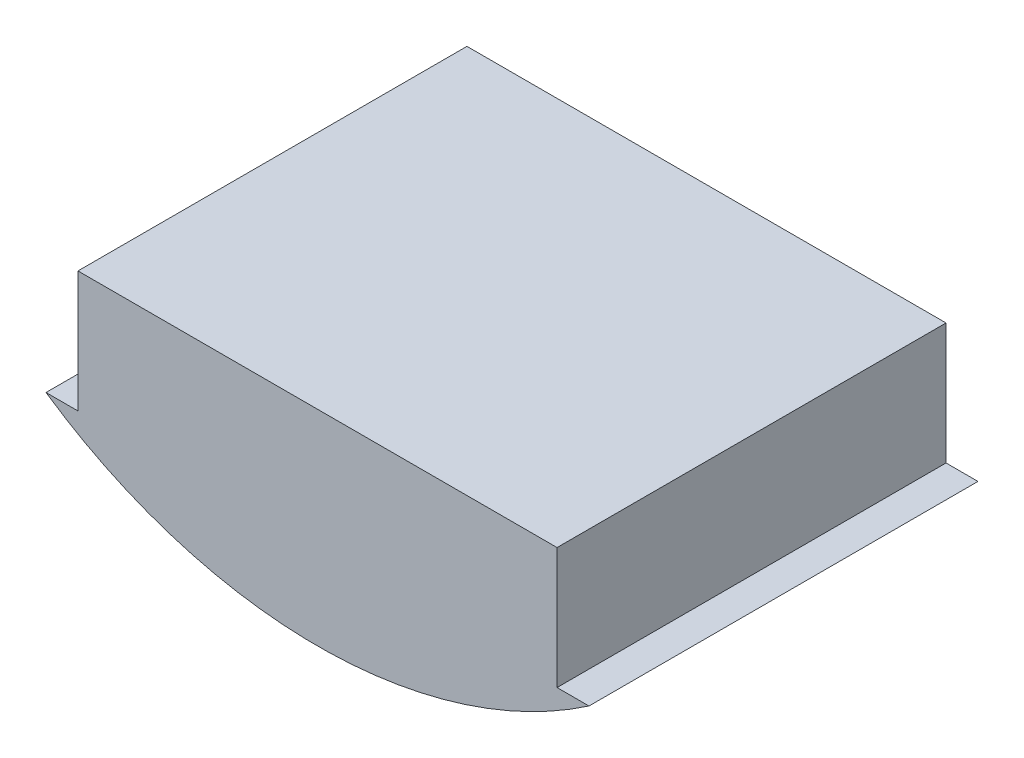
ISO-10303-21;
HEADER;
FILE_DESCRIPTION(('STEP AP214'),'2;1');
FILE_NAME('part.step','',(''),(''),'','','');
FILE_SCHEMA(('AUTOMOTIVE_DESIGN { 1 0 10303 214 1 1 1 1 }'));
ENDSEC;
DATA;
#1=APPLICATION_CONTEXT('core data for automotive mechanical design processes');
#2=APPLICATION_PROTOCOL_DEFINITION('international standard','automotive_design',2000,#1);
#3=PRODUCT_CONTEXT('',#1,'mechanical');
#4=PRODUCT('Part','Part','',(#3));
#5=PRODUCT_RELATED_PRODUCT_CATEGORY('part','',(#4));
#6=PRODUCT_DEFINITION_FORMATION('','',#4);
#7=PRODUCT_DEFINITION_CONTEXT('part definition',#1,'design');
#8=PRODUCT_DEFINITION('design','',#6,#7);
#9=PRODUCT_DEFINITION_SHAPE('','',#8);
#10=(LENGTH_UNIT() NAMED_UNIT(*) SI_UNIT(.MILLI.,.METRE.));
#11=(NAMED_UNIT(*) PLANE_ANGLE_UNIT() SI_UNIT($,.RADIAN.));
#12=(NAMED_UNIT(*) SI_UNIT($,.STERADIAN.) SOLID_ANGLE_UNIT());
#13=UNCERTAINTY_MEASURE_WITH_UNIT(LENGTH_MEASURE(1.E-05),#10,'distance_accuracy_value','');
#14=(GEOMETRIC_REPRESENTATION_CONTEXT(3) GLOBAL_UNCERTAINTY_ASSIGNED_CONTEXT((#13)) GLOBAL_UNIT_ASSIGNED_CONTEXT((#10,
#11,#12)) REPRESENTATION_CONTEXT('',''));
#15=CARTESIAN_POINT('',(0.,0.,0.));
#16=DIRECTION('',(0.,0.,1.));
#17=DIRECTION('',(1.,0.,0.));
#18=AXIS2_PLACEMENT_3D('',#15,#16,#17);
#19=CARTESIAN_POINT('',(0.,-40.910956910097,59.6890545936463));
#20=DIRECTION('',(0.,-1.,0.));
#21=DIRECTION('',(1.,0.,0.));
#22=AXIS2_PLACEMENT_3D('',#19,#20,#21);
#23=PLANE('',#22);
#24=DIRECTION('',(0.,0.,-1.));
#25=VECTOR('',#24,1.);
#26=CARTESIAN_POINT('',(24.6330793796293,-40.9109569100969,59.6890545936463));
#27=LINE('',#26,#25);
#28=CARTESIAN_POINT('',(24.6330793796293,-40.9109569100969,0.));
#29=VERTEX_POINT('',#28);
#30=CARTESIAN_POINT('',(24.6330793796293,-40.9109569100969,-40.));
#31=VERTEX_POINT('',#30);
#32=EDGE_CURVE('E126',#29,#31,#27,.T.);
#33=ORIENTED_EDGE('',*,*,#32,.F.);
#34=DIRECTION('',(1.,0.,0.));
#35=VECTOR('',#34,1.);
#36=CARTESIAN_POINT('',(0.,-40.910956910097,0.));
#37=LINE('',#36,#35);
#38=CARTESIAN_POINT('',(27.9197869744773,-40.9109569100969,0.));
#39=VERTEX_POINT('',#38);
#40=EDGE_CURVE('E50',#29,#39,#37,.T.);
#41=ORIENTED_EDGE('',*,*,#40,.T.);
#42=DIRECTION('',(0.,0.,-1.));
#43=VECTOR('',#42,1.);
#44=CARTESIAN_POINT('',(27.9197869744773,-40.9109569100969,59.6890545936463));
#45=LINE('',#44,#43);
#46=CARTESIAN_POINT('',(27.9197869744773,-40.9109569100969,-40.));
#47=VERTEX_POINT('',#46);
#48=EDGE_CURVE('E93',#39,#47,#45,.T.);
#49=ORIENTED_EDGE('',*,*,#48,.T.);
#50=DIRECTION('',(-1.,0.,0.));
#51=VECTOR('',#50,1.);
#52=CARTESIAN_POINT('',(0.,-40.910956910097,-40.));
#53=LINE('',#52,#51);
#54=EDGE_CURVE('E96',#47,#31,#53,.T.);
#55=ORIENTED_EDGE('',*,*,#54,.T.);
#56=EDGE_LOOP('',(#33,#41,#49,#55));
#57=FACE_BOUND('',#56,.T.);
#58=ADVANCED_FACE('F43',(#57),#23,.F.);
#59=CARTESIAN_POINT('',(24.6330793796293,0.,59.6890545936463));
#60=DIRECTION('',(-1.,0.,0.));
#61=DIRECTION('',(0.,-1.,0.));
#62=AXIS2_PLACEMENT_3D('',#59,#60,#61);
#63=PLANE('',#62);
#64=DIRECTION('',(0.,0.,-1.));
#65=VECTOR('',#64,1.);
#66=CARTESIAN_POINT('',(24.6330793796293,-28.4414908188724,59.6890545936463));
#67=LINE('',#66,#65);
#68=CARTESIAN_POINT('',(24.6330793796293,-28.4414908188724,0.));
#69=VERTEX_POINT('',#68);
#70=CARTESIAN_POINT('',(24.6330793796293,-28.4414908188724,-40.));
#71=VERTEX_POINT('',#70);
#72=EDGE_CURVE('E129',#69,#71,#67,.T.);
#73=ORIENTED_EDGE('',*,*,#72,.F.);
#74=DIRECTION('',(0.,-1.,0.));
#75=VECTOR('',#74,1.);
#76=CARTESIAN_POINT('',(24.6330793796293,0.,0.));
#77=LINE('',#76,#75);
#78=EDGE_CURVE('E57',#69,#29,#77,.T.);
#79=ORIENTED_EDGE('',*,*,#78,.T.);
#80=ORIENTED_EDGE('',*,*,#32,.T.);
#81=DIRECTION('',(0.,1.,0.));
#82=VECTOR('',#81,1.);
#83=CARTESIAN_POINT('',(24.6330793796293,0.,-40.));
#84=LINE('',#83,#82);
#85=EDGE_CURVE('E101',#31,#71,#84,.T.);
#86=ORIENTED_EDGE('',*,*,#85,.T.);
#87=EDGE_LOOP('',(#73,#79,#80,#86));
#88=FACE_BOUND('',#87,.T.);
#89=ADVANCED_FACE('F147',(#88),#63,.F.);
#90=CARTESIAN_POINT('',(0.,-28.4414908188724,59.6890545936463));
#91=DIRECTION('',(0.,-1.,0.));
#92=DIRECTION('',(0.,0.,-1.));
#93=AXIS2_PLACEMENT_3D('',#90,#91,#92);
#94=PLANE('',#93);
#95=DIRECTION('',(0.,0.,-1.));
#96=VECTOR('',#95,1.);
#97=CARTESIAN_POINT('',(-24.6330793796293,-28.4414908188724,59.6890545936463));
#98=LINE('',#97,#96);
#99=CARTESIAN_POINT('',(-24.6330793796293,-28.4414908188724,0.));
#100=VERTEX_POINT('',#99);
#101=CARTESIAN_POINT('',(-24.6330793796293,-28.4414908188724,-40.));
#102=VERTEX_POINT('',#101);
#103=EDGE_CURVE('E131',#100,#102,#98,.T.);
#104=ORIENTED_EDGE('',*,*,#103,.F.);
#105=DIRECTION('',(1.,0.,0.));
#106=VECTOR('',#105,1.);
#107=CARTESIAN_POINT('',(0.,-28.4414908188724,0.));
#108=LINE('',#107,#106);
#109=EDGE_CURVE('E61',#100,#69,#108,.T.);
#110=ORIENTED_EDGE('',*,*,#109,.T.);
#111=ORIENTED_EDGE('',*,*,#72,.T.);
#112=DIRECTION('',(-1.,0.,0.));
#113=VECTOR('',#112,1.);
#114=CARTESIAN_POINT('',(0.,-28.4414908188724,-40.));
#115=LINE('',#114,#113);
#116=EDGE_CURVE('E122',#71,#102,#115,.T.);
#117=ORIENTED_EDGE('',*,*,#116,.T.);
#118=EDGE_LOOP('',(#104,#110,#111,#117));
#119=FACE_BOUND('',#118,.T.);
#120=ADVANCED_FACE('F144',(#119),#94,.F.);
#121=CARTESIAN_POINT('',(-24.6330793796293,0.,59.6890545936463));
#122=DIRECTION('',(1.,0.,0.));
#123=DIRECTION('',(0.,1.,0.));
#124=AXIS2_PLACEMENT_3D('',#121,#122,#123);
#125=PLANE('',#124);
#126=DIRECTION('',(0.,0.,-1.));
#127=VECTOR('',#126,1.);
#128=CARTESIAN_POINT('',(-24.6330793796293,-40.9109569100969,59.6890545936463));
#129=LINE('',#128,#127);
#130=CARTESIAN_POINT('',(-24.6330793796293,-40.9109569100969,0.));
#131=VERTEX_POINT('',#130);
#132=CARTESIAN_POINT('',(-24.6330793796293,-40.9109569100969,-40.));
#133=VERTEX_POINT('',#132);
#134=EDGE_CURVE('E133',#131,#133,#129,.T.);
#135=ORIENTED_EDGE('',*,*,#134,.F.);
#136=DIRECTION('',(0.,1.,0.));
#137=VECTOR('',#136,1.);
#138=CARTESIAN_POINT('',(-24.6330793796293,0.,0.));
#139=LINE('',#138,#137);
#140=EDGE_CURVE('E149',#131,#100,#139,.T.);
#141=ORIENTED_EDGE('',*,*,#140,.T.);
#142=ORIENTED_EDGE('',*,*,#103,.T.);
#143=DIRECTION('',(0.,-1.,0.));
#144=VECTOR('',#143,1.);
#145=CARTESIAN_POINT('',(-24.6330793796293,0.,-40.));
#146=LINE('',#145,#144);
#147=EDGE_CURVE('E116',#102,#133,#146,.T.);
#148=ORIENTED_EDGE('',*,*,#147,.T.);
#149=EDGE_LOOP('',(#135,#141,#142,#148));
#150=FACE_BOUND('',#149,.T.);
#151=ADVANCED_FACE('F141',(#150),#125,.F.);
#152=CARTESIAN_POINT('',(0.,-40.910956910097,59.6890545936463));
#153=DIRECTION('',(0.,-1.,0.));
#154=DIRECTION('',(1.,0.,0.));
#155=AXIS2_PLACEMENT_3D('',#152,#153,#154);
#156=PLANE('',#155);
#157=DIRECTION('',(0.,0.,-1.));
#158=VECTOR('',#157,1.);
#159=CARTESIAN_POINT('',(-27.9197869744773,-40.9109569100969,59.6890545936463));
#160=LINE('',#159,#158);
#161=CARTESIAN_POINT('',(-27.9197869744773,-40.9109569100969,0.));
#162=VERTEX_POINT('',#161);
#163=CARTESIAN_POINT('',(-27.9197869744773,-40.9109569100969,-40.));
#164=VERTEX_POINT('',#163);
#165=EDGE_CURVE('E100',#162,#164,#160,.T.);
#166=ORIENTED_EDGE('',*,*,#165,.F.);
#167=DIRECTION('',(1.,0.,0.));
#168=VECTOR('',#167,1.);
#169=CARTESIAN_POINT('',(0.,-40.910956910097,0.));
#170=LINE('',#169,#168);
#171=EDGE_CURVE('E128',#162,#131,#170,.T.);
#172=ORIENTED_EDGE('',*,*,#171,.T.);
#173=ORIENTED_EDGE('',*,*,#134,.T.);
#174=DIRECTION('',(-1.,0.,0.));
#175=VECTOR('',#174,1.);
#176=CARTESIAN_POINT('',(0.,-40.910956910097,-40.));
#177=LINE('',#176,#175);
#178=EDGE_CURVE('E114',#133,#164,#177,.T.);
#179=ORIENTED_EDGE('',*,*,#178,.T.);
#180=EDGE_LOOP('',(#166,#172,#173,#179));
#181=FACE_BOUND('',#180,.T.);
#182=ADVANCED_FACE('F138',(#181),#156,.F.);
#183=CARTESIAN_POINT('',(0.,0.,59.6890545936463));
#184=DIRECTION('',(0.,0.,-1.));
#185=DIRECTION('',(-1.,0.,0.));
#186=AXIS2_PLACEMENT_3D('',#183,#184,#185);
#187=CYLINDRICAL_SURFACE('',#186,49.53);
#188=CARTESIAN_POINT('',(0.,0.,0.));
#189=DIRECTION('',(0.,0.,-1.));
#190=DIRECTION('',(-1.,0.,0.));
#191=AXIS2_PLACEMENT_3D('',#188,#189,#190);
#192=CIRCLE('',#191,49.53);
#193=EDGE_CURVE('E11',#162,#39,#192,.F.);
#194=ORIENTED_EDGE('',*,*,#193,.F.);
#195=ORIENTED_EDGE('',*,*,#165,.T.);
#196=CARTESIAN_POINT('',(0.,0.,-40.));
#197=DIRECTION('',(0.,0.,-1.));
#198=DIRECTION('',(-1.,0.,0.));
#199=AXIS2_PLACEMENT_3D('',#196,#197,#198);
#200=CIRCLE('',#199,49.53);
#201=EDGE_CURVE('E107',#47,#164,#200,.T.);
#202=ORIENTED_EDGE('',*,*,#201,.F.);
#203=ORIENTED_EDGE('',*,*,#48,.F.);
#204=EDGE_LOOP('',(#194,#195,#202,#203));
#205=FACE_BOUND('',#204,.T.);
#206=ADVANCED_FACE('F111',(#205),#187,.T.);
#207=CARTESIAN_POINT('',(0.,0.,-40.));
#208=DIRECTION('',(0.,0.,-1.));
#209=DIRECTION('',(-1.,0.,0.));
#210=AXIS2_PLACEMENT_3D('',#207,#208,#209);
#211=PLANE('',#210);
#212=ORIENTED_EDGE('',*,*,#54,.F.);
#213=ORIENTED_EDGE('',*,*,#201,.T.);
#214=ORIENTED_EDGE('',*,*,#178,.F.);
#215=ORIENTED_EDGE('',*,*,#147,.F.);
#216=ORIENTED_EDGE('',*,*,#116,.F.);
#217=ORIENTED_EDGE('',*,*,#85,.F.);
#218=EDGE_LOOP('',(#212,#213,#214,#215,#216,#217));
#219=FACE_BOUND('',#218,.T.);
#220=ADVANCED_FACE('F105',(#219),#211,.T.);
#221=CARTESIAN_POINT('',(0.,0.,0.));
#222=DIRECTION('',(0.,0.,-1.));
#223=DIRECTION('',(0.,-1.,0.));
#224=AXIS2_PLACEMENT_3D('',#221,#222,#223);
#225=PLANE('',#224);
#226=ORIENTED_EDGE('',*,*,#78,.F.);
#227=ORIENTED_EDGE('',*,*,#109,.F.);
#228=ORIENTED_EDGE('',*,*,#140,.F.);
#229=ORIENTED_EDGE('',*,*,#171,.F.);
#230=ORIENTED_EDGE('',*,*,#193,.T.);
#231=ORIENTED_EDGE('',*,*,#40,.F.);
#232=EDGE_LOOP('',(#226,#227,#228,#229,#230,#231));
#233=FACE_BOUND('',#232,.T.);
#234=ADVANCED_FACE('F153',(#233),#225,.F.);
#235=CLOSED_SHELL('',(#58,#89,#120,#151,#182,#206,#220,#234));
#236=MANIFOLD_SOLID_BREP('B2',#235);
#237=ADVANCED_BREP_SHAPE_REPRESENTATION('',(#18,#236),#14);
#238=SHAPE_DEFINITION_REPRESENTATION(#9,#237);
ENDSEC;
END-ISO-10303-21;
